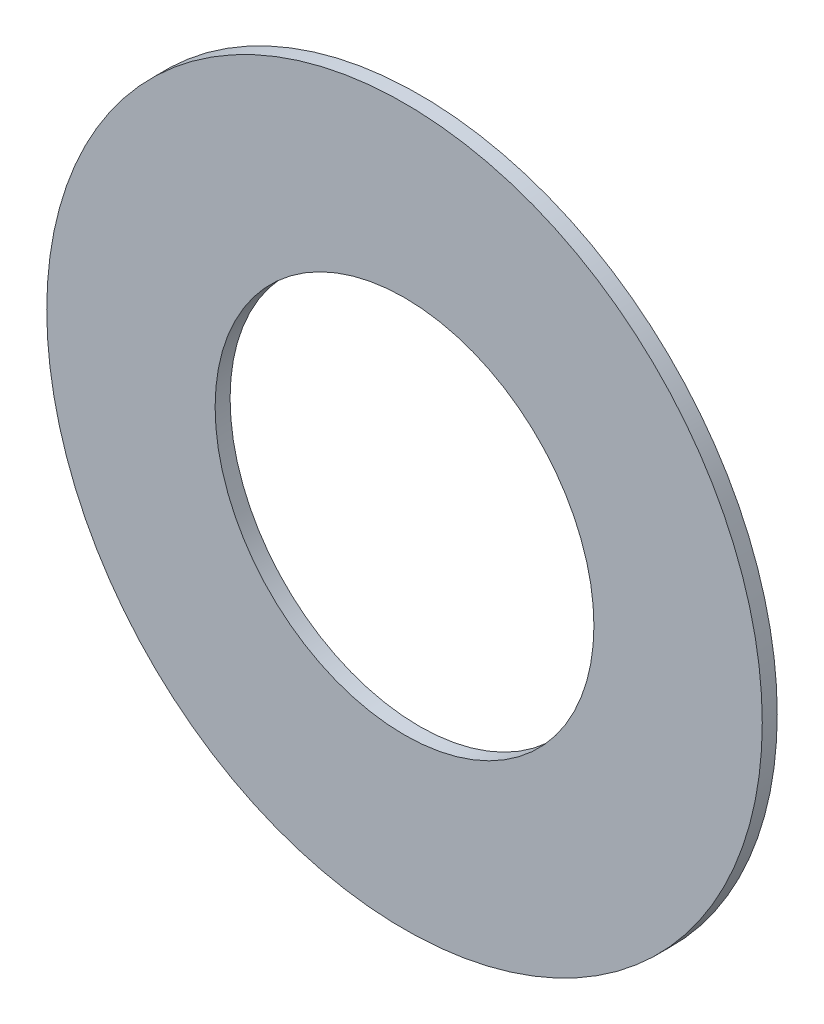
ISO-10303-21;
HEADER;
FILE_DESCRIPTION(('STEP AP214'),'2;1');
FILE_NAME('part.step','',(''),(''),'','','');
FILE_SCHEMA(('AUTOMOTIVE_DESIGN { 1 0 10303 214 1 1 1 1 }'));
ENDSEC;
DATA;
#1=APPLICATION_CONTEXT('core data for automotive mechanical design processes');
#2=APPLICATION_PROTOCOL_DEFINITION('international standard','automotive_design',2000,#1);
#3=PRODUCT_CONTEXT('',#1,'mechanical');
#4=PRODUCT('Part','Part','',(#3));
#5=PRODUCT_RELATED_PRODUCT_CATEGORY('part','',(#4));
#6=PRODUCT_DEFINITION_FORMATION('','',#4);
#7=PRODUCT_DEFINITION_CONTEXT('part definition',#1,'design');
#8=PRODUCT_DEFINITION('design','',#6,#7);
#9=PRODUCT_DEFINITION_SHAPE('','',#8);
#10=(LENGTH_UNIT() NAMED_UNIT(*) SI_UNIT(.MILLI.,.METRE.));
#11=(NAMED_UNIT(*) PLANE_ANGLE_UNIT() SI_UNIT($,.RADIAN.));
#12=(NAMED_UNIT(*) SI_UNIT($,.STERADIAN.) SOLID_ANGLE_UNIT());
#13=UNCERTAINTY_MEASURE_WITH_UNIT(LENGTH_MEASURE(1.E-05),#10,'distance_accuracy_value','');
#14=(GEOMETRIC_REPRESENTATION_CONTEXT(3) GLOBAL_UNCERTAINTY_ASSIGNED_CONTEXT((#13)) GLOBAL_UNIT_ASSIGNED_CONTEXT((#10,
#11,#12)) REPRESENTATION_CONTEXT('',''));
#15=CARTESIAN_POINT('',(0.,0.,0.));
#16=DIRECTION('',(0.,0.,1.));
#17=DIRECTION('',(1.,0.,0.));
#18=AXIS2_PLACEMENT_3D('',#15,#16,#17);
#19=CARTESIAN_POINT('',(0.,0.,0.));
#20=DIRECTION('',(0.,0.,-1.));
#21=DIRECTION('',(1.,0.,0.));
#22=AXIS2_PLACEMENT_3D('',#19,#20,#21);
#23=CYLINDRICAL_SURFACE('',#22,0.8499983);
#24=CARTESIAN_POINT('',(0.,0.,0.03556));
#25=DIRECTION('',(0.,0.,1.));
#26=DIRECTION('',(1.,0.,0.));
#27=AXIS2_PLACEMENT_3D('',#24,#25,#26);
#28=CIRCLE('',#27,0.8499983);
#29=CARTESIAN_POINT('',(0.8499983,0.,0.03556));
#30=VERTEX_POINT('',#29);
#31=EDGE_CURVE('E11',#30,#30,#28,.T.);
#32=ORIENTED_EDGE('',*,*,#31,.F.);
#33=DIRECTION('',(0.,0.,1.));
#34=VECTOR('',#33,1.);
#35=CARTESIAN_POINT('',(0.8499983,0.,0.));
#36=LINE('',#35,#34);
#37=CARTESIAN_POINT('',(0.8499983,0.,0.));
#38=VERTEX_POINT('',#37);
#39=EDGE_CURVE('E24',#38,#30,#36,.T.);
#40=ORIENTED_EDGE('',*,*,#39,.F.);
#41=CARTESIAN_POINT('',(0.,0.,0.));
#42=DIRECTION('',(0.,0.,1.));
#43=DIRECTION('',(1.,0.,0.));
#44=AXIS2_PLACEMENT_3D('',#41,#42,#43);
#45=CIRCLE('',#44,0.8499983);
#46=EDGE_CURVE('E46',#38,#38,#45,.T.);
#47=ORIENTED_EDGE('',*,*,#46,.T.);
#48=ORIENTED_EDGE('',*,*,#39,.T.);
#49=EDGE_LOOP('',(#32,#40,#47,#48));
#50=FACE_BOUND('',#49,.T.);
#51=ADVANCED_FACE('F17',(#50),#23,.T.);
#52=CARTESIAN_POINT('',(0.,0.,0.));
#53=DIRECTION('',(0.,0.,-1.));
#54=DIRECTION('',(1.,0.,0.));
#55=AXIS2_PLACEMENT_3D('',#52,#53,#54);
#56=CYLINDRICAL_SURFACE('',#55,0.4499991);
#57=DIRECTION('',(0.,0.,1.));
#58=VECTOR('',#57,1.);
#59=CARTESIAN_POINT('',(0.4499991,0.,0.));
#60=LINE('',#59,#58);
#61=CARTESIAN_POINT('',(0.4499991,0.,0.));
#62=VERTEX_POINT('',#61);
#63=CARTESIAN_POINT('',(0.4499991,0.,0.03556));
#64=VERTEX_POINT('',#63);
#65=EDGE_CURVE('E40',#62,#64,#60,.T.);
#66=ORIENTED_EDGE('',*,*,#65,.T.);
#67=CARTESIAN_POINT('',(0.,0.,0.03556));
#68=DIRECTION('',(0.,0.,1.));
#69=DIRECTION('',(1.,0.,0.));
#70=AXIS2_PLACEMENT_3D('',#67,#68,#69);
#71=CIRCLE('',#70,0.4499991);
#72=EDGE_CURVE('E45',#64,#64,#71,.T.);
#73=ORIENTED_EDGE('',*,*,#72,.T.);
#74=ORIENTED_EDGE('',*,*,#65,.F.);
#75=CARTESIAN_POINT('',(0.,0.,0.));
#76=DIRECTION('',(0.,0.,1.));
#77=DIRECTION('',(1.,0.,0.));
#78=AXIS2_PLACEMENT_3D('',#75,#76,#77);
#79=CIRCLE('',#78,0.4499991);
#80=EDGE_CURVE('E43',#62,#62,#79,.T.);
#81=ORIENTED_EDGE('',*,*,#80,.F.);
#82=EDGE_LOOP('',(#66,#73,#74,#81));
#83=FACE_BOUND('',#82,.T.);
#84=ADVANCED_FACE('F42',(#83),#56,.F.);
#85=CARTESIAN_POINT('',(0.8499983,0.,0.));
#86=DIRECTION('',(0.,0.,-1.));
#87=DIRECTION('',(-1.,0.,0.));
#88=AXIS2_PLACEMENT_3D('',#85,#86,#87);
#89=PLANE('',#88);
#90=ORIENTED_EDGE('',*,*,#46,.F.);
#91=EDGE_LOOP('',(#90));
#92=FACE_BOUND('',#91,.T.);
#93=ORIENTED_EDGE('',*,*,#80,.T.);
#94=EDGE_LOOP('',(#93));
#95=FACE_BOUND('',#94,.T.);
#96=ADVANCED_FACE('F49',(#92,#95),#89,.T.);
#97=CARTESIAN_POINT('',(0.8499983,0.,0.03556));
#98=DIRECTION('',(0.,0.,-1.));
#99=DIRECTION('',(-1.,0.,0.));
#100=AXIS2_PLACEMENT_3D('',#97,#98,#99);
#101=PLANE('',#100);
#102=ORIENTED_EDGE('',*,*,#31,.T.);
#103=EDGE_LOOP('',(#102));
#104=FACE_BOUND('',#103,.T.);
#105=ORIENTED_EDGE('',*,*,#72,.F.);
#106=EDGE_LOOP('',(#105));
#107=FACE_BOUND('',#106,.T.);
#108=ADVANCED_FACE('F56',(#104,#107),#101,.F.);
#109=CLOSED_SHELL('',(#51,#84,#96,#108));
#110=MANIFOLD_SOLID_BREP('B1',#109);
#111=ADVANCED_BREP_SHAPE_REPRESENTATION('',(#18,#110),#14);
#112=SHAPE_DEFINITION_REPRESENTATION(#9,#111);
ENDSEC;
END-ISO-10303-21;
